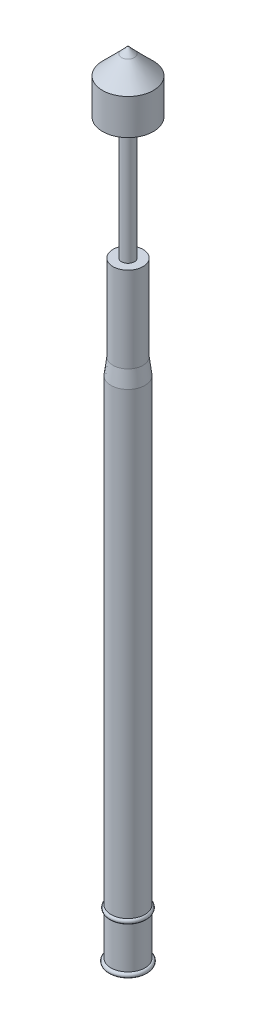
ISO-10303-21;
HEADER;
FILE_DESCRIPTION(('STEP AP214'),'2;1');
FILE_NAME('part.step','',(''),(''),'','','');
FILE_SCHEMA(('AUTOMOTIVE_DESIGN { 1 0 10303 214 1 1 1 1 }'));
ENDSEC;
DATA;
#1=APPLICATION_CONTEXT('core data for automotive mechanical design processes');
#2=APPLICATION_PROTOCOL_DEFINITION('international standard','automotive_design',2000,#1);
#3=PRODUCT_CONTEXT('',#1,'mechanical');
#4=PRODUCT('Part','Part','',(#3));
#5=PRODUCT_RELATED_PRODUCT_CATEGORY('part','',(#4));
#6=PRODUCT_DEFINITION_FORMATION('','',#4);
#7=PRODUCT_DEFINITION_CONTEXT('part definition',#1,'design');
#8=PRODUCT_DEFINITION('design','',#6,#7);
#9=PRODUCT_DEFINITION_SHAPE('','',#8);
#10=(LENGTH_UNIT() NAMED_UNIT(*) SI_UNIT(.MILLI.,.METRE.));
#11=(NAMED_UNIT(*) PLANE_ANGLE_UNIT() SI_UNIT($,.RADIAN.));
#12=(NAMED_UNIT(*) SI_UNIT($,.STERADIAN.) SOLID_ANGLE_UNIT());
#13=UNCERTAINTY_MEASURE_WITH_UNIT(LENGTH_MEASURE(1.E-05),#10,'distance_accuracy_value','');
#14=(GEOMETRIC_REPRESENTATION_CONTEXT(3) GLOBAL_UNCERTAINTY_ASSIGNED_CONTEXT((#13)) GLOBAL_UNIT_ASSIGNED_CONTEXT((#10,
#11,#12)) REPRESENTATION_CONTEXT('',''));
#15=CARTESIAN_POINT('',(0.,0.,0.));
#16=DIRECTION('',(0.,0.,1.));
#17=DIRECTION('',(1.,0.,0.));
#18=AXIS2_PLACEMENT_3D('',#15,#16,#17);
#19=CARTESIAN_POINT('',(0.,39.,0.));
#20=DIRECTION('',(0.,-1.,0.));
#21=DIRECTION('',(0.,0.,-1.));
#22=AXIS2_PLACEMENT_3D('',#19,#20,#21);
#23=CYLINDRICAL_SURFACE('',#22,0.32);
#24=CARTESIAN_POINT('',(0.,36.,0.));
#25=DIRECTION('',(0.,-1.,0.));
#26=DIRECTION('',(1.,0.,0.));
#27=AXIS2_PLACEMENT_3D('',#24,#25,#26);
#28=CIRCLE('',#27,0.32);
#29=CARTESIAN_POINT('',(0.32,36.,0.));
#30=VERTEX_POINT('',#29);
#31=EDGE_CURVE('E55',#30,#30,#28,.T.);
#32=ORIENTED_EDGE('',*,*,#31,.T.);
#33=EDGE_LOOP('',(#32));
#34=FACE_BOUND('',#33,.T.);
#35=CARTESIAN_POINT('',(0.,30.,0.));
#36=DIRECTION('',(0.,1.,0.));
#37=DIRECTION('',(0.,0.,1.));
#38=AXIS2_PLACEMENT_3D('',#35,#36,#37);
#39=CIRCLE('',#38,0.32);
#40=CARTESIAN_POINT('',(0.,30.,0.32));
#41=VERTEX_POINT('',#40);
#42=EDGE_CURVE('E11',#41,#41,#39,.T.);
#43=ORIENTED_EDGE('',*,*,#42,.T.);
#44=EDGE_LOOP('',(#43));
#45=FACE_BOUND('',#44,.T.);
#46=ADVANCED_FACE('F51',(#34,#45),#23,.T.);
#47=CARTESIAN_POINT('',(0.,30.,0.));
#48=DIRECTION('',(0.,-1.,0.));
#49=DIRECTION('',(0.,0.,-1.));
#50=AXIS2_PLACEMENT_3D('',#47,#48,#49);
#51=CYLINDRICAL_SURFACE('',#50,0.735);
#52=CARTESIAN_POINT('',(0.,25.8,0.));
#53=DIRECTION('',(0.,-1.,0.));
#54=DIRECTION('',(0.,0.,-1.));
#55=AXIS2_PLACEMENT_3D('',#52,#53,#54);
#56=CIRCLE('',#55,0.735);
#57=CARTESIAN_POINT('',(0.,25.8,-0.735));
#58=VERTEX_POINT('',#57);
#59=EDGE_CURVE('E88',#58,#58,#56,.T.);
#60=ORIENTED_EDGE('',*,*,#59,.F.);
#61=EDGE_LOOP('',(#60));
#62=FACE_BOUND('',#61,.T.);
#63=CARTESIAN_POINT('',(0.,30.,0.));
#64=DIRECTION('',(0.,1.,0.));
#65=DIRECTION('',(0.,0.,1.));
#66=AXIS2_PLACEMENT_3D('',#63,#64,#65);
#67=CIRCLE('',#66,0.735);
#68=CARTESIAN_POINT('',(0.,30.,0.735));
#69=VERTEX_POINT('',#68);
#70=EDGE_CURVE('E92',#69,#69,#67,.T.);
#71=ORIENTED_EDGE('',*,*,#70,.F.);
#72=EDGE_LOOP('',(#71));
#73=FACE_BOUND('',#72,.T.);
#74=ADVANCED_FACE('F133',(#62,#73),#51,.T.);
#75=CARTESIAN_POINT('',(0.,30.,0.));
#76=DIRECTION('',(0.,1.,0.));
#77=DIRECTION('',(0.,0.,1.));
#78=AXIS2_PLACEMENT_3D('',#75,#76,#77);
#79=PLANE('',#78);
#80=ORIENTED_EDGE('',*,*,#42,.F.);
#81=EDGE_LOOP('',(#80));
#82=FACE_BOUND('',#81,.T.);
#83=ORIENTED_EDGE('',*,*,#70,.T.);
#84=EDGE_LOOP('',(#83));
#85=FACE_BOUND('',#84,.T.);
#86=ADVANCED_FACE('F139',(#82,#85),#79,.T.);
#87=CARTESIAN_POINT('',(0.,25.,0.));
#88=DIRECTION('',(0.,-1.,0.));
#89=DIRECTION('',(0.,0.,-1.));
#90=AXIS2_PLACEMENT_3D('',#87,#88,#89);
#91=CONICAL_SURFACE('',#90,0.835,0.124354994546762);
#92=ORIENTED_EDGE('',*,*,#59,.T.);
#93=EDGE_LOOP('',(#92));
#94=FACE_BOUND('',#93,.T.);
#95=CARTESIAN_POINT('',(0.,25.,0.));
#96=DIRECTION('',(0.,1.,0.));
#97=DIRECTION('',(0.,0.,1.));
#98=AXIS2_PLACEMENT_3D('',#95,#96,#97);
#99=CIRCLE('',#98,0.835);
#100=CARTESIAN_POINT('',(0.,25.,0.835));
#101=VERTEX_POINT('',#100);
#102=EDGE_CURVE('E60',#101,#101,#99,.T.);
#103=ORIENTED_EDGE('',*,*,#102,.T.);
#104=EDGE_LOOP('',(#103));
#105=FACE_BOUND('',#104,.T.);
#106=ADVANCED_FACE('F145',(#94,#105),#91,.T.);
#107=CARTESIAN_POINT('',(0.,25.,0.));
#108=DIRECTION('',(0.,-1.,0.));
#109=DIRECTION('',(0.,0.,-1.));
#110=AXIS2_PLACEMENT_3D('',#107,#108,#109);
#111=CYLINDRICAL_SURFACE('',#110,0.835);
#112=CARTESIAN_POINT('',(0.,2.5,0.));
#113=DIRECTION('',(0.,-1.,0.));
#114=DIRECTION('',(0.,0.,-1.));
#115=AXIS2_PLACEMENT_3D('',#112,#113,#114);
#116=CIRCLE('',#115,0.835);
#117=CARTESIAN_POINT('',(0.,2.5,-0.835));
#118=VERTEX_POINT('',#117);
#119=EDGE_CURVE('E98',#118,#118,#116,.T.);
#120=ORIENTED_EDGE('',*,*,#119,.F.);
#121=EDGE_LOOP('',(#120));
#122=FACE_BOUND('',#121,.T.);
#123=ORIENTED_EDGE('',*,*,#102,.F.);
#124=EDGE_LOOP('',(#123));
#125=FACE_BOUND('',#124,.T.);
#126=ADVANCED_FACE('F53',(#122,#125),#111,.T.);
#127=CARTESIAN_POINT('',(0.,2.385,0.));
#128=DIRECTION('',(0.,-1.,0.));
#129=DIRECTION('',(0.,0.,-1.));
#130=AXIS2_PLACEMENT_3D('',#127,#128,#129);
#131=TOROIDAL_SURFACE('',#130,0.79234375,0.12265625);
#132=ORIENTED_EDGE('',*,*,#119,.T.);
#133=EDGE_LOOP('',(#132));
#134=FACE_BOUND('',#133,.T.);
#135=CARTESIAN_POINT('',(0.,2.27,0.));
#136=DIRECTION('',(0.,-1.,0.));
#137=DIRECTION('',(0.,0.,-1.));
#138=AXIS2_PLACEMENT_3D('',#135,#136,#137);
#139=CIRCLE('',#138,0.835);
#140=CARTESIAN_POINT('',(0.,2.27,-0.835));
#141=VERTEX_POINT('',#140);
#142=EDGE_CURVE('E97',#141,#141,#139,.T.);
#143=ORIENTED_EDGE('',*,*,#142,.F.);
#144=EDGE_LOOP('',(#143));
#145=FACE_BOUND('',#144,.T.);
#146=ADVANCED_FACE('F159',(#134,#145),#131,.T.);
#147=CARTESIAN_POINT('',(0.,0.23,0.));
#148=DIRECTION('',(0.,-1.,0.));
#149=DIRECTION('',(0.,0.,-1.));
#150=AXIS2_PLACEMENT_3D('',#147,#148,#149);
#151=CIRCLE('',#150,0.835);
#152=CARTESIAN_POINT('',(0.,0.23,-0.835));
#153=VERTEX_POINT('',#152);
#154=EDGE_CURVE('E93',#153,#153,#151,.T.);
#155=ORIENTED_EDGE('',*,*,#154,.F.);
#156=EDGE_LOOP('',(#155));
#157=FACE_BOUND('',#156,.T.);
#158=ORIENTED_EDGE('',*,*,#142,.T.);
#159=EDGE_LOOP('',(#158));
#160=FACE_BOUND('',#159,.T.);
#161=ADVANCED_FACE('F128',(#157,#160),#111,.T.);
#162=CARTESIAN_POINT('',(0.,0.115,0.));
#163=DIRECTION('',(0.,-1.,0.));
#164=DIRECTION('',(0.,0.,-1.));
#165=AXIS2_PLACEMENT_3D('',#162,#163,#164);
#166=TOROIDAL_SURFACE('',#165,0.835,0.115);
#167=ORIENTED_EDGE('',*,*,#154,.T.);
#168=EDGE_LOOP('',(#167));
#169=FACE_BOUND('',#168,.T.);
#170=CARTESIAN_POINT('',(0.,0.,0.));
#171=DIRECTION('',(0.,1.,0.));
#172=DIRECTION('',(0.,0.,1.));
#173=AXIS2_PLACEMENT_3D('',#170,#171,#172);
#174=CIRCLE('',#173,0.835);
#175=CARTESIAN_POINT('',(0.,0.,0.835));
#176=VERTEX_POINT('',#175);
#177=EDGE_CURVE('E108',#176,#176,#174,.T.);
#178=ORIENTED_EDGE('',*,*,#177,.T.);
#179=EDGE_LOOP('',(#178));
#180=FACE_BOUND('',#179,.T.);
#181=ADVANCED_FACE('F115',(#169,#180),#166,.T.);
#182=CARTESIAN_POINT('',(0.,0.,0.));
#183=DIRECTION('',(0.,1.,0.));
#184=DIRECTION('',(0.,0.,1.));
#185=AXIS2_PLACEMENT_3D('',#182,#183,#184);
#186=PLANE('',#185);
#187=ORIENTED_EDGE('',*,*,#177,.F.);
#188=EDGE_LOOP('',(#187));
#189=FACE_BOUND('',#188,.T.);
#190=ADVANCED_FACE('F117',(#189),#186,.F.);
#191=CARTESIAN_POINT('',(0.,39.,0.));
#192=DIRECTION('',(0.,-1.,0.));
#193=DIRECTION('',(1.,0.,0.));
#194=AXIS2_PLACEMENT_3D('',#191,#192,#193);
#195=CONICAL_SURFACE('',#194,0.,0.785398163397446);
#196=CARTESIAN_POINT('',(0.,37.75,0.));
#197=DIRECTION('',(0.,1.,0.));
#198=DIRECTION('',(-1.,0.,0.));
#199=AXIS2_PLACEMENT_3D('',#196,#197,#198);
#200=CIRCLE('',#199,1.25);
#201=CARTESIAN_POINT('',(1.24999999999999,37.75,0.));
#202=VERTEX_POINT('',#201);
#203=EDGE_CURVE('E74',#202,#202,#200,.T.);
#204=CARTESIAN_POINT('',(0.,38.68,0.));
#205=DIRECTION('',(0.,1.,0.));
#206=DIRECTION('',(-1.,0.,0.));
#207=AXIS2_PLACEMENT_3D('',#204,#205,#206);
#208=CIRCLE('',#207,0.320000000000006);
#209=CARTESIAN_POINT('',(0.319999999999996,38.68,0.));
#210=VERTEX_POINT('',#209);
#211=EDGE_CURVE('E75',#210,#210,#208,.T.);
#212=CARTESIAN_POINT('',(1.24999999999999,37.75,0.));
#213=CARTESIAN_POINT('',(1.24031249999999,37.7596875,0.));
#214=CARTESIAN_POINT('',(1.23062499999999,37.769375,0.));
#215=CARTESIAN_POINT('',(1.21124999999999,37.78875,0.));
#216=CARTESIAN_POINT('',(1.20156249999999,37.7984375,0.));
#217=CARTESIAN_POINT('',(1.18218749999999,37.8178125,0.));
#218=CARTESIAN_POINT('',(1.17249999999999,37.8275,0.));
#219=CARTESIAN_POINT('',(1.15312499999999,37.846875,0.));
#220=CARTESIAN_POINT('',(1.14343749999999,37.8565625,0.));
#221=CARTESIAN_POINT('',(1.12406249999999,37.8759375,0.));
#222=CARTESIAN_POINT('',(1.11437499999999,37.885625,0.));
#223=CARTESIAN_POINT('',(1.09499999999999,37.905,0.));
#224=CARTESIAN_POINT('',(1.08531249999999,37.9146875,0.));
#225=CARTESIAN_POINT('',(1.06593749999999,37.9340625,0.));
#226=CARTESIAN_POINT('',(1.05624999999999,37.94375,0.));
#227=CARTESIAN_POINT('',(1.03687499999999,37.963125,0.));
#228=CARTESIAN_POINT('',(1.02718749999999,37.9728125,0.));
#229=CARTESIAN_POINT('',(1.00781249999999,37.9921875,0.));
#230=CARTESIAN_POINT('',(0.998124999999994,38.001875,0.));
#231=CARTESIAN_POINT('',(0.978749999999993,38.02125,0.));
#232=CARTESIAN_POINT('',(0.969062499999992,38.0309375,0.));
#233=CARTESIAN_POINT('',(0.949687499999992,38.0503125,0.));
#234=CARTESIAN_POINT('',(0.939999999999993,38.06,0.));
#235=CARTESIAN_POINT('',(0.920624999999993,38.079375,0.));
#236=CARTESIAN_POINT('',(0.910937499999992,38.0890625,0.));
#237=CARTESIAN_POINT('',(0.891562499999992,38.1084375,0.));
#238=CARTESIAN_POINT('',(0.881874999999994,38.118125,0.));
#239=CARTESIAN_POINT('',(0.862499999999994,38.1375,0.));
#240=CARTESIAN_POINT('',(0.852812499999993,38.1471875,0.));
#241=CARTESIAN_POINT('',(0.833437499999993,38.1665625,0.));
#242=CARTESIAN_POINT('',(0.823749999999994,38.17625,0.));
#243=CARTESIAN_POINT('',(0.804374999999994,38.195625,0.));
#244=CARTESIAN_POINT('',(0.794687499999993,38.2053125,0.));
#245=CARTESIAN_POINT('',(0.775312499999993,38.2246875,0.));
#246=CARTESIAN_POINT('',(0.765624999999993,38.234375,0.));
#247=CARTESIAN_POINT('',(0.746249999999994,38.25375,0.));
#248=CARTESIAN_POINT('',(0.736562499999995,38.2634375,0.));
#249=CARTESIAN_POINT('',(0.717187499999994,38.2828125,0.));
#250=CARTESIAN_POINT('',(0.707499999999993,38.2925,0.));
#251=CARTESIAN_POINT('',(0.688124999999994,38.311875,0.));
#252=CARTESIAN_POINT('',(0.678437499999995,38.3215625,0.));
#253=CARTESIAN_POINT('',(0.659062499999995,38.3409375,0.));
#254=CARTESIAN_POINT('',(0.649374999999994,38.350625,0.));
#255=CARTESIAN_POINT('',(0.629999999999994,38.37,0.));
#256=CARTESIAN_POINT('',(0.620312499999995,38.3796875,0.));
#257=CARTESIAN_POINT('',(0.600937499999995,38.3990625,0.));
#258=CARTESIAN_POINT('',(0.591249999999994,38.40875,0.));
#259=CARTESIAN_POINT('',(0.571874999999994,38.428125,0.));
#260=CARTESIAN_POINT('',(0.562187499999994,38.4378125,0.));
#261=CARTESIAN_POINT('',(0.542812499999995,38.4571875,0.));
#262=CARTESIAN_POINT('',(0.533124999999996,38.466875,0.));
#263=CARTESIAN_POINT('',(0.513749999999995,38.48625,0.));
#264=CARTESIAN_POINT('',(0.504062499999994,38.4959375,0.));
#265=CARTESIAN_POINT('',(0.484687499999995,38.5153125,0.));
#266=CARTESIAN_POINT('',(0.474999999999996,38.525,0.));
#267=CARTESIAN_POINT('',(0.455624999999996,38.544375,0.));
#268=CARTESIAN_POINT('',(0.445937499999995,38.5540625,0.));
#269=CARTESIAN_POINT('',(0.426562499999995,38.5734375,0.));
#270=CARTESIAN_POINT('',(0.416874999999996,38.583125,0.));
#271=CARTESIAN_POINT('',(0.397499999999996,38.6025,0.));
#272=CARTESIAN_POINT('',(0.387812499999995,38.6121875,0.));
#273=CARTESIAN_POINT('',(0.368437499999995,38.6315625,0.));
#274=CARTESIAN_POINT('',(0.358749999999995,38.64125,0.));
#275=CARTESIAN_POINT('',(0.339374999999996,38.660625,0.));
#276=CARTESIAN_POINT('',(0.329687499999997,38.6703125,0.));
#277=CARTESIAN_POINT('',(0.319999999999996,38.68,0.));
#278=B_SPLINE_CURVE_WITH_KNOTS('',3,(#212,#213,#214,#215,#216,#217,#218,#219,#220,#221,#222,
#223,#224,#225,#226,#227,#228,#229,#230,#231,#232,#233,#234,#235,#236,#237,#238,#239,#240,#241,
#242,#243,#244,#245,#246,#247,#248,#249,#250,#251,#252,#253,#254,#255,#256,#257,#258,#259,#260,
#261,#262,#263,#264,#265,#266,#267,#268,#269,#270,#271,#272,#273,#274,#275,#276,#277),
.UNSPECIFIED.,.F.,.F.,(4,2,2,2,2,2,2,2,2,2,2,2,2,2,2,2,2,2,2,2,2,2,2,2,2,2,2,2,2,2,2,2,4),(0.,
0.0411005816564652,0.0822011633129353,0.123301744969401,0.164402326625871,0.205502908282336,
0.246603489938806,0.287704071595271,0.328804653251741,0.369905234908211,0.411005816564677,
0.452106398221147,0.493206979877612,0.534307561534082,0.575408143190547,0.616508724847018,
0.657609306503483,0.698709888159953,0.739810469816423,0.780911051472888,0.822011633129358,
0.863112214785824,0.904212796442294,0.945313378098759,0.986413959755229,1.0275145414117,
1.06861512306816,1.10971570472463,1.1508162863811,1.19191686803757,1.23301744969404,
1.27411803135051,1.31521861300698),.UNSPECIFIED.);
#279=EDGE_CURVE('BSEAM119',#202,#210,#278,.T.);
#280=ORIENTED_EDGE('',*,*,#203,.T.);
#281=ORIENTED_EDGE('',*,*,#211,.F.);
#282=ORIENTED_EDGE('',*,*,#279,.T.);
#283=ORIENTED_EDGE('',*,*,#279,.F.);
#284=EDGE_LOOP('',(#280,#282,#281,#283));
#285=FACE_BOUND('',#284,.T.);
#286=ADVANCED_FACE('F119',(#285),#195,.T.);
#287=CARTESIAN_POINT('',(-1.25,36.,0.));
#288=DIRECTION('',(0.,-1.,0.));
#289=DIRECTION('',(1.,0.,0.));
#290=AXIS2_PLACEMENT_3D('',#287,#288,#289);
#291=PLANE('',#290);
#292=ORIENTED_EDGE('',*,*,#31,.F.);
#293=EDGE_LOOP('',(#292));
#294=FACE_BOUND('',#293,.T.);
#295=CARTESIAN_POINT('',(0.,36.,0.));
#296=DIRECTION('',(0.,1.,0.));
#297=DIRECTION('',(-1.,0.,0.));
#298=AXIS2_PLACEMENT_3D('',#295,#296,#297);
#299=CIRCLE('',#298,1.25);
#300=CARTESIAN_POINT('',(-1.25,36.,0.));
#301=VERTEX_POINT('',#300);
#302=EDGE_CURVE('E80',#301,#301,#299,.T.);
#303=ORIENTED_EDGE('',*,*,#302,.F.);
#304=EDGE_LOOP('',(#303));
#305=FACE_BOUND('',#304,.T.);
#306=ADVANCED_FACE('F124',(#294,#305),#291,.T.);
#307=CARTESIAN_POINT('',(0.,0.,0.));
#308=DIRECTION('',(0.,1.,0.));
#309=DIRECTION('',(-1.,0.,0.));
#310=AXIS2_PLACEMENT_3D('',#307,#308,#309);
#311=CYLINDRICAL_SURFACE('',#310,1.25);
#312=ORIENTED_EDGE('',*,*,#302,.T.);
#313=EDGE_LOOP('',(#312));
#314=FACE_BOUND('',#313,.T.);
#315=ORIENTED_EDGE('',*,*,#203,.F.);
#316=EDGE_LOOP('',(#315));
#317=FACE_BOUND('',#316,.T.);
#318=ADVANCED_FACE('F208',(#314,#317),#311,.T.);
#319=CARTESIAN_POINT('',(0.,39.,0.));
#320=DIRECTION('',(0.,-1.,0.));
#321=DIRECTION('',(1.,0.,0.));
#322=AXIS2_PLACEMENT_3D('',#319,#320,#321);
#323=CONICAL_SURFACE('',#322,0.0200000000000055,0.753151280962193);
#324=CARTESIAN_POINT('',(0.,39.,0.));
#325=DIRECTION('',(0.,1.,0.));
#326=DIRECTION('',(-1.,0.,0.));
#327=AXIS2_PLACEMENT_3D('',#324,#325,#326);
#328=CIRCLE('',#327,0.0200000000000055);
#329=CARTESIAN_POINT('',(0.0199999999999968,39.,0.));
#330=VERTEX_POINT('',#329);
#331=EDGE_CURVE('E71',#330,#330,#328,.T.);
#332=CARTESIAN_POINT('',(0.319999999999997,38.68,0.));
#333=CARTESIAN_POINT('',(0.316874999999995,38.6833333333333,0.));
#334=CARTESIAN_POINT('',(0.313749999999996,38.6866666666667,0.));
#335=CARTESIAN_POINT('',(0.307499999999997,38.6933333333333,0.));
#336=CARTESIAN_POINT('',(0.304374999999998,38.6966666666667,0.));
#337=CARTESIAN_POINT('',(0.298124999999997,38.7033333333333,0.));
#338=CARTESIAN_POINT('',(0.294999999999996,38.7066666666667,0.));
#339=CARTESIAN_POINT('',(0.288749999999996,38.7133333333333,0.));
#340=CARTESIAN_POINT('',(0.285624999999997,38.7166666666667,0.));
#341=CARTESIAN_POINT('',(0.279374999999997,38.7233333333333,0.));
#342=CARTESIAN_POINT('',(0.276249999999996,38.7266666666667,0.));
#343=CARTESIAN_POINT('',(0.269999999999996,38.7333333333333,0.));
#344=CARTESIAN_POINT('',(0.266874999999997,38.7366666666667,0.));
#345=CARTESIAN_POINT('',(0.260624999999997,38.7433333333333,0.));
#346=CARTESIAN_POINT('',(0.257499999999997,38.7466666666667,0.));
#347=CARTESIAN_POINT('',(0.251249999999996,38.7533333333333,0.));
#348=CARTESIAN_POINT('',(0.248124999999996,38.7566666666667,0.));
#349=CARTESIAN_POINT('',(0.241874999999997,38.7633333333333,0.));
#350=CARTESIAN_POINT('',(0.238749999999998,38.7666666666667,0.));
#351=CARTESIAN_POINT('',(0.232499999999997,38.7733333333333,0.));
#352=CARTESIAN_POINT('',(0.229374999999996,38.7766666666667,0.));
#353=CARTESIAN_POINT('',(0.223124999999996,38.7833333333333,0.));
#354=CARTESIAN_POINT('',(0.219999999999997,38.7866666666667,0.));
#355=CARTESIAN_POINT('',(0.213749999999997,38.7933333333333,0.));
#356=CARTESIAN_POINT('',(0.210624999999996,38.7966666666667,0.));
#357=CARTESIAN_POINT('',(0.204374999999996,38.8033333333333,0.));
#358=CARTESIAN_POINT('',(0.201249999999997,38.8066666666667,0.));
#359=CARTESIAN_POINT('',(0.194999999999997,38.8133333333333,0.));
#360=CARTESIAN_POINT('',(0.191874999999996,38.8166666666667,0.));
#361=CARTESIAN_POINT('',(0.185624999999996,38.8233333333333,0.));
#362=CARTESIAN_POINT('',(0.182499999999997,38.8266666666667,0.));
#363=CARTESIAN_POINT('',(0.176249999999997,38.8333333333333,0.));
#364=CARTESIAN_POINT('',(0.173124999999997,38.8366666666667,0.));
#365=CARTESIAN_POINT('',(0.166874999999996,38.8433333333333,0.));
#366=CARTESIAN_POINT('',(0.163749999999996,38.8466666666667,0.));
#367=CARTESIAN_POINT('',(0.157499999999997,38.8533333333333,0.));
#368=CARTESIAN_POINT('',(0.154374999999998,38.8566666666667,0.));
#369=CARTESIAN_POINT('',(0.148124999999997,38.8633333333333,0.));
#370=CARTESIAN_POINT('',(0.144999999999996,38.8666666666667,0.));
#371=CARTESIAN_POINT('',(0.138749999999996,38.8733333333333,0.));
#372=CARTESIAN_POINT('',(0.135624999999997,38.8766666666667,0.));
#373=CARTESIAN_POINT('',(0.129374999999997,38.8833333333333,0.));
#374=CARTESIAN_POINT('',(0.126249999999996,38.8866666666667,0.));
#375=CARTESIAN_POINT('',(0.119999999999996,38.8933333333333,0.));
#376=CARTESIAN_POINT('',(0.116874999999997,38.8966666666667,0.));
#377=CARTESIAN_POINT('',(0.110624999999997,38.9033333333333,0.));
#378=CARTESIAN_POINT('',(0.107499999999997,38.9066666666667,0.));
#379=CARTESIAN_POINT('',(0.101249999999996,38.9133333333333,0.));
#380=CARTESIAN_POINT('',(0.0981249999999964,38.9166666666667,0.));
#381=CARTESIAN_POINT('',(0.0918749999999972,38.9233333333333,0.));
#382=CARTESIAN_POINT('',(0.0887499999999977,38.9266666666667,0.));
#383=CARTESIAN_POINT('',(0.0824999999999971,38.9333333333333,0.));
#384=CARTESIAN_POINT('',(0.0793749999999962,38.9366666666667,0.));
#385=CARTESIAN_POINT('',(0.0731249999999963,38.9433333333333,0.));
#386=CARTESIAN_POINT('',(0.0699999999999974,38.9466666666667,0.));
#387=CARTESIAN_POINT('',(0.0637499999999974,38.9533333333333,0.));
#388=CARTESIAN_POINT('',(0.0606249999999962,38.9566666666667,0.));
#389=CARTESIAN_POINT('',(0.0543749999999962,38.9633333333333,0.));
#390=CARTESIAN_POINT('',(0.0512499999999973,38.9666666666667,0.));
#391=CARTESIAN_POINT('',(0.0449999999999974,38.9733333333333,0.));
#392=CARTESIAN_POINT('',(0.0418749999999965,38.9766666666667,0.));
#393=CARTESIAN_POINT('',(0.035624999999996,38.9833333333333,0.));
#394=CARTESIAN_POINT('',(0.0324999999999964,38.9866666666667,0.));
#395=CARTESIAN_POINT('',(0.0262499999999972,38.9933333333333,0.));
#396=CARTESIAN_POINT('',(0.0231249999999976,38.9966666666667,0.));
#397=CARTESIAN_POINT('',(0.0199999999999968,39.,0.));
#398=B_SPLINE_CURVE_WITH_KNOTS('',3,(#332,#333,#334,#335,#336,#337,#338,#339,#340,#341,#342,
#343,#344,#345,#346,#347,#348,#349,#350,#351,#352,#353,#354,#355,#356,#357,#358,#359,#360,#361,
#362,#363,#364,#365,#366,#367,#368,#369,#370,#371,#372,#373,#374,#375,#376,#377,#378,#379,#380,
#381,#382,#383,#384,#385,#386,#387,#388,#389,#390,#391,#392,#393,#394,#395,#396,#397),
.UNSPECIFIED.,.F.,.F.,(4,2,2,2,2,2,2,2,2,2,2,2,2,2,2,2,2,2,2,2,2,2,2,2,2,2,2,2,2,2,2,2,4),(0.,
0.0137073201246605,0.0274146402493261,0.0411219603739866,0.0548292804986521,0.0685366006233126,
0.0822439207479781,0.0959512408726386,0.109658560997304,0.12336588112197,0.13707320124663,
0.150780521371296,0.164487841495956,0.178195161620622,0.191902481745282,0.205609801869948,
0.219317121994608,0.233024442119274,0.24673176224394,0.2604390823686,0.274146402493266,
0.287853722617926,0.301561042742592,0.315268362867252,0.328975682991918,0.342683003116583,
0.356390323241244,0.370097643365909,0.38380496349057,0.397512283615235,0.411219603739896,
0.424926923864561,0.438634243989227),.UNSPECIFIED.);
#399=EDGE_CURVE('BSEAM67',#210,#330,#398,.T.);
#400=ORIENTED_EDGE('',*,*,#211,.T.);
#401=ORIENTED_EDGE('',*,*,#331,.F.);
#402=ORIENTED_EDGE('',*,*,#399,.T.);
#403=ORIENTED_EDGE('',*,*,#399,.F.);
#404=EDGE_LOOP('',(#400,#402,#401,#403));
#405=FACE_BOUND('',#404,.T.);
#406=ADVANCED_FACE('F67',(#405),#323,.T.);
#407=CARTESIAN_POINT('',(0.,39.,0.));
#408=DIRECTION('',(0.,1.,0.));
#409=DIRECTION('',(0.,0.,1.));
#410=AXIS2_PLACEMENT_3D('',#407,#408,#409);
#411=PLANE('',#410);
#412=CARTESIAN_POINT('',(0.,39.,0.));
#413=VERTEX_POINT('',#412);
#414=VERTEX_LOOP('',#413);
#415=FACE_BOUND('',#414,.T.);
#416=ORIENTED_EDGE('',*,*,#331,.T.);
#417=EDGE_LOOP('',(#416));
#418=FACE_BOUND('',#417,.T.);
#419=ADVANCED_FACE('F64',(#415,#418),#411,.T.);
#420=CLOSED_SHELL('',(#46,#74,#86,#106,#126,#146,#161,#181,#190,#286,#306,#318,#406,#419));
#421=MANIFOLD_SOLID_BREP('B2',#420);
#422=ADVANCED_BREP_SHAPE_REPRESENTATION('',(#18,#421),#14);
#423=SHAPE_DEFINITION_REPRESENTATION(#9,#422);
ENDSEC;
END-ISO-10303-21;
